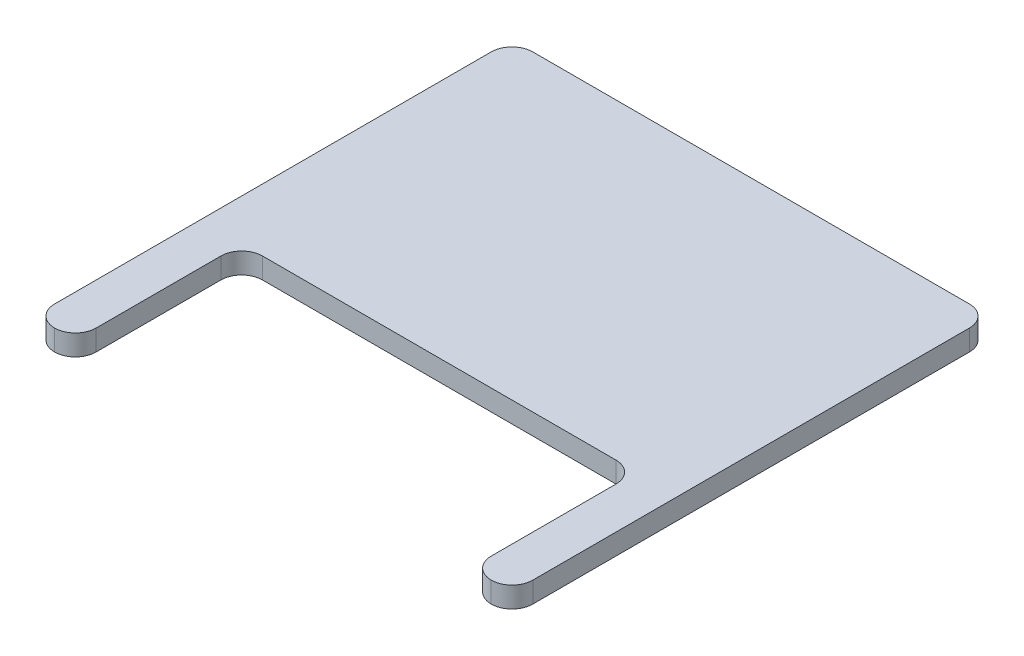
ISO-10303-21;
HEADER;
FILE_DESCRIPTION(('STEP AP214'),'2;1');
FILE_NAME('part.step','',(''),(''),'','','');
FILE_SCHEMA(('AUTOMOTIVE_DESIGN { 1 0 10303 214 1 1 1 1 }'));
ENDSEC;
DATA;
#1=APPLICATION_CONTEXT('core data for automotive mechanical design processes');
#2=APPLICATION_PROTOCOL_DEFINITION('international standard','automotive_design',2000,#1);
#3=PRODUCT_CONTEXT('',#1,'mechanical');
#4=PRODUCT('Part','Part','',(#3));
#5=PRODUCT_RELATED_PRODUCT_CATEGORY('part','',(#4));
#6=PRODUCT_DEFINITION_FORMATION('','',#4);
#7=PRODUCT_DEFINITION_CONTEXT('part definition',#1,'design');
#8=PRODUCT_DEFINITION('design','',#6,#7);
#9=PRODUCT_DEFINITION_SHAPE('','',#8);
#10=(LENGTH_UNIT() NAMED_UNIT(*) SI_UNIT(.MILLI.,.METRE.));
#11=(NAMED_UNIT(*) PLANE_ANGLE_UNIT() SI_UNIT($,.RADIAN.));
#12=(NAMED_UNIT(*) SI_UNIT($,.STERADIAN.) SOLID_ANGLE_UNIT());
#13=UNCERTAINTY_MEASURE_WITH_UNIT(LENGTH_MEASURE(1.E-05),#10,'distance_accuracy_value','');
#14=(GEOMETRIC_REPRESENTATION_CONTEXT(3) GLOBAL_UNCERTAINTY_ASSIGNED_CONTEXT((#13)) GLOBAL_UNIT_ASSIGNED_CONTEXT((#10,
#11,#12)) REPRESENTATION_CONTEXT('',''));
#15=CARTESIAN_POINT('',(0.,0.,0.));
#16=DIRECTION('',(0.,0.,1.));
#17=DIRECTION('',(1.,0.,0.));
#18=AXIS2_PLACEMENT_3D('',#15,#16,#17);
#19=CARTESIAN_POINT('',(-133.35,6.35,0.));
#20=DIRECTION('',(1.,0.,0.));
#21=DIRECTION('',(0.,0.,-1.));
#22=AXIS2_PLACEMENT_3D('',#19,#20,#21);
#23=PLANE('',#22);
#24=DIRECTION('',(0.,0.,1.));
#25=VECTOR('',#24,1.);
#26=CARTESIAN_POINT('',(-133.35,0.,0.));
#27=LINE('',#26,#25);
#28=CARTESIAN_POINT('',(-133.35,0.,101.6));
#29=VERTEX_POINT('',#28);
#30=CARTESIAN_POINT('',(-133.35,0.,139.7));
#31=VERTEX_POINT('',#30);
#32=EDGE_CURVE('E259',#29,#31,#27,.T.);
#33=ORIENTED_EDGE('',*,*,#32,.F.);
#34=DIRECTION('',(0.,-1.,0.));
#35=VECTOR('',#34,1.);
#36=CARTESIAN_POINT('',(-133.35,6.35,101.6));
#37=LINE('',#36,#35);
#38=CARTESIAN_POINT('',(-133.35,6.35,101.6));
#39=VERTEX_POINT('',#38);
#40=EDGE_CURVE('E198',#29,#39,#37,.F.);
#41=ORIENTED_EDGE('',*,*,#40,.T.);
#42=DIRECTION('',(0.,0.,1.));
#43=VECTOR('',#42,1.);
#44=CARTESIAN_POINT('',(-133.35,6.35,0.));
#45=LINE('',#44,#43);
#46=CARTESIAN_POINT('',(-133.35,6.35,139.7));
#47=VERTEX_POINT('',#46);
#48=EDGE_CURVE('E276',#39,#47,#45,.T.);
#49=ORIENTED_EDGE('',*,*,#48,.T.);
#50=DIRECTION('',(0.,-1.,0.));
#51=VECTOR('',#50,1.);
#52=CARTESIAN_POINT('',(-133.35,6.35,139.7));
#53=LINE('',#52,#51);
#54=EDGE_CURVE('E195',#47,#31,#53,.T.);
#55=ORIENTED_EDGE('',*,*,#54,.T.);
#56=EDGE_LOOP('',(#33,#41,#49,#55));
#57=FACE_BOUND('',#56,.T.);
#58=ADVANCED_FACE('F41',(#57),#23,.T.);
#59=CARTESIAN_POINT('',(0.,6.35,95.25));
#60=DIRECTION('',(0.,0.,1.));
#61=DIRECTION('',(1.,0.,0.));
#62=AXIS2_PLACEMENT_3D('',#59,#60,#61);
#63=PLANE('',#62);
#64=DIRECTION('',(-1.,0.,0.));
#65=VECTOR('',#64,1.);
#66=CARTESIAN_POINT('',(0.,0.,95.25));
#67=LINE('',#66,#65);
#68=CARTESIAN_POINT('',(-19.05,0.,95.25));
#69=VERTEX_POINT('',#68);
#70=CARTESIAN_POINT('',(-127.,0.,95.25));
#71=VERTEX_POINT('',#70);
#72=EDGE_CURVE('E171',#69,#71,#67,.T.);
#73=ORIENTED_EDGE('',*,*,#72,.F.);
#74=DIRECTION('',(0.,-1.,0.));
#75=VECTOR('',#74,1.);
#76=CARTESIAN_POINT('',(-19.05,6.35,95.25));
#77=LINE('',#76,#75);
#78=CARTESIAN_POINT('',(-19.05,6.35,95.25));
#79=VERTEX_POINT('',#78);
#80=EDGE_CURVE('E192',#69,#79,#77,.F.);
#81=ORIENTED_EDGE('',*,*,#80,.T.);
#82=DIRECTION('',(-1.,0.,0.));
#83=VECTOR('',#82,1.);
#84=CARTESIAN_POINT('',(0.,6.35,95.25));
#85=LINE('',#84,#83);
#86=CARTESIAN_POINT('',(-127.,6.35,95.25));
#87=VERTEX_POINT('',#86);
#88=EDGE_CURVE('E282',#79,#87,#85,.T.);
#89=ORIENTED_EDGE('',*,*,#88,.T.);
#90=DIRECTION('',(0.,-1.,0.));
#91=VECTOR('',#90,1.);
#92=CARTESIAN_POINT('',(-127.,0.,95.25));
#93=LINE('',#92,#91);
#94=EDGE_CURVE('E181',#87,#71,#93,.T.);
#95=ORIENTED_EDGE('',*,*,#94,.T.);
#96=EDGE_LOOP('',(#73,#81,#89,#95));
#97=FACE_BOUND('',#96,.T.);
#98=ADVANCED_FACE('F324',(#97),#63,.T.);
#99=CARTESIAN_POINT('',(-12.7,6.35,0.));
#100=DIRECTION('',(-1.,0.,0.));
#101=DIRECTION('',(0.,0.,1.));
#102=AXIS2_PLACEMENT_3D('',#99,#100,#101);
#103=PLANE('',#102);
#104=DIRECTION('',(0.,0.,-1.));
#105=VECTOR('',#104,1.);
#106=CARTESIAN_POINT('',(-12.7,6.35,0.));
#107=LINE('',#106,#105);
#108=CARTESIAN_POINT('',(-12.7,6.35,139.7));
#109=VERTEX_POINT('',#108);
#110=CARTESIAN_POINT('',(-12.7,6.35,101.6));
#111=VERTEX_POINT('',#110);
#112=EDGE_CURVE('E287',#109,#111,#107,.T.);
#113=ORIENTED_EDGE('',*,*,#112,.T.);
#114=DIRECTION('',(0.,-1.,0.));
#115=VECTOR('',#114,1.);
#116=CARTESIAN_POINT('',(-12.7,0.,101.6));
#117=LINE('',#116,#115);
#118=CARTESIAN_POINT('',(-12.7,0.,101.6));
#119=VERTEX_POINT('',#118);
#120=EDGE_CURVE('E168',#111,#119,#117,.T.);
#121=ORIENTED_EDGE('',*,*,#120,.T.);
#122=DIRECTION('',(0.,0.,-1.));
#123=VECTOR('',#122,1.);
#124=CARTESIAN_POINT('',(-12.7,0.,0.));
#125=LINE('',#124,#123);
#126=CARTESIAN_POINT('',(-12.7,0.,139.7));
#127=VERTEX_POINT('',#126);
#128=EDGE_CURVE('E151',#127,#119,#125,.T.);
#129=ORIENTED_EDGE('',*,*,#128,.F.);
#130=DIRECTION('',(0.,-1.,0.));
#131=VECTOR('',#130,1.);
#132=CARTESIAN_POINT('',(-12.7,6.35,139.7));
#133=LINE('',#132,#131);
#134=EDGE_CURVE('E165',#127,#109,#133,.F.);
#135=ORIENTED_EDGE('',*,*,#134,.T.);
#136=EDGE_LOOP('',(#113,#121,#129,#135));
#137=FACE_BOUND('',#136,.T.);
#138=ADVANCED_FACE('F164',(#137),#103,.T.);
#139=CARTESIAN_POINT('',(0.,6.35,0.));
#140=DIRECTION('',(1.,0.,0.));
#141=DIRECTION('',(0.,0.,-1.));
#142=AXIS2_PLACEMENT_3D('',#139,#140,#141);
#143=PLANE('',#142);
#144=DIRECTION('',(0.,0.,1.));
#145=VECTOR('',#144,1.);
#146=CARTESIAN_POINT('',(0.,6.35,0.));
#147=LINE('',#146,#145);
#148=CARTESIAN_POINT('',(0.,6.35,6.35));
#149=VERTEX_POINT('',#148);
#150=CARTESIAN_POINT('',(0.,6.35,139.7));
#151=VERTEX_POINT('',#150);
#152=EDGE_CURVE('E294',#149,#151,#147,.T.);
#153=ORIENTED_EDGE('',*,*,#152,.T.);
#154=DIRECTION('',(0.,-1.,0.));
#155=VECTOR('',#154,1.);
#156=CARTESIAN_POINT('',(0.,6.35,139.7));
#157=LINE('',#156,#155);
#158=CARTESIAN_POINT('',(0.,0.,139.7));
#159=VERTEX_POINT('',#158);
#160=EDGE_CURVE('E204',#151,#159,#157,.T.);
#161=ORIENTED_EDGE('',*,*,#160,.T.);
#162=DIRECTION('',(0.,0.,1.));
#163=VECTOR('',#162,1.);
#164=CARTESIAN_POINT('',(0.,0.,0.));
#165=LINE('',#164,#163);
#166=CARTESIAN_POINT('',(0.,0.,6.35));
#167=VERTEX_POINT('',#166);
#168=EDGE_CURVE('E170',#167,#159,#165,.T.);
#169=ORIENTED_EDGE('',*,*,#168,.F.);
#170=DIRECTION('',(0.,-1.,0.));
#171=VECTOR('',#170,1.);
#172=CARTESIAN_POINT('',(0.,6.35,6.35));
#173=LINE('',#172,#171);
#174=EDGE_CURVE('E201',#167,#149,#173,.F.);
#175=ORIENTED_EDGE('',*,*,#174,.T.);
#176=EDGE_LOOP('',(#153,#161,#169,#175));
#177=FACE_BOUND('',#176,.T.);
#178=ADVANCED_FACE('F333',(#177),#143,.T.);
#179=CARTESIAN_POINT('',(0.,6.35,0.));
#180=DIRECTION('',(0.,0.,1.));
#181=DIRECTION('',(1.,0.,0.));
#182=AXIS2_PLACEMENT_3D('',#179,#180,#181);
#183=PLANE('',#182);
#184=DIRECTION('',(-1.,0.,0.));
#185=VECTOR('',#184,1.);
#186=CARTESIAN_POINT('',(0.,0.,0.));
#187=LINE('',#186,#185);
#188=CARTESIAN_POINT('',(-6.35,0.,0.));
#189=VERTEX_POINT('',#188);
#190=CARTESIAN_POINT('',(-139.7,0.,0.));
#191=VERTEX_POINT('',#190);
#192=EDGE_CURVE('E290',#189,#191,#187,.T.);
#193=ORIENTED_EDGE('',*,*,#192,.T.);
#194=DIRECTION('',(0.,-1.,0.));
#195=VECTOR('',#194,1.);
#196=CARTESIAN_POINT('',(-139.7,6.35,0.));
#197=LINE('',#196,#195);
#198=CARTESIAN_POINT('',(-139.7,6.35,0.));
#199=VERTEX_POINT('',#198);
#200=EDGE_CURVE('E247',#191,#199,#197,.F.);
#201=ORIENTED_EDGE('',*,*,#200,.T.);
#202=DIRECTION('',(-1.,0.,0.));
#203=VECTOR('',#202,1.);
#204=CARTESIAN_POINT('',(0.,6.35,0.));
#205=LINE('',#204,#203);
#206=CARTESIAN_POINT('',(-6.35,6.35,0.));
#207=VERTEX_POINT('',#206);
#208=EDGE_CURVE('E183',#207,#199,#205,.T.);
#209=ORIENTED_EDGE('',*,*,#208,.F.);
#210=DIRECTION('',(0.,-1.,0.));
#211=VECTOR('',#210,1.);
#212=CARTESIAN_POINT('',(-6.35,0.,0.));
#213=LINE('',#212,#211);
#214=EDGE_CURVE('E243',#207,#189,#213,.T.);
#215=ORIENTED_EDGE('',*,*,#214,.T.);
#216=EDGE_LOOP('',(#193,#201,#209,#215));
#217=FACE_BOUND('',#216,.T.);
#218=ADVANCED_FACE('F309',(#217),#183,.F.);
#219=CARTESIAN_POINT('',(-146.05,6.35,0.));
#220=DIRECTION('',(1.,0.,0.));
#221=DIRECTION('',(0.,0.,-1.));
#222=AXIS2_PLACEMENT_3D('',#219,#220,#221);
#223=PLANE('',#222);
#224=DIRECTION('',(0.,0.,1.));
#225=VECTOR('',#224,1.);
#226=CARTESIAN_POINT('',(-146.05,6.35,0.));
#227=LINE('',#226,#225);
#228=CARTESIAN_POINT('',(-146.05,6.35,6.35000000000002));
#229=VERTEX_POINT('',#228);
#230=CARTESIAN_POINT('',(-146.05,6.35,139.7));
#231=VERTEX_POINT('',#230);
#232=EDGE_CURVE('E177',#229,#231,#227,.T.);
#233=ORIENTED_EDGE('',*,*,#232,.F.);
#234=DIRECTION('',(0.,-1.,0.));
#235=VECTOR('',#234,1.);
#236=CARTESIAN_POINT('',(-146.05,6.35,6.35000000000002));
#237=LINE('',#236,#235);
#238=CARTESIAN_POINT('',(-146.05,0.,6.35000000000002));
#239=VERTEX_POINT('',#238);
#240=EDGE_CURVE('E239',#229,#239,#237,.T.);
#241=ORIENTED_EDGE('',*,*,#240,.T.);
#242=DIRECTION('',(0.,0.,1.));
#243=VECTOR('',#242,1.);
#244=CARTESIAN_POINT('',(-146.05,0.,0.));
#245=LINE('',#244,#243);
#246=CARTESIAN_POINT('',(-146.05,0.,139.7));
#247=VERTEX_POINT('',#246);
#248=EDGE_CURVE('E186',#239,#247,#245,.T.);
#249=ORIENTED_EDGE('',*,*,#248,.T.);
#250=DIRECTION('',(0.,-1.,0.));
#251=VECTOR('',#250,1.);
#252=CARTESIAN_POINT('',(-146.05,6.35,139.7));
#253=LINE('',#252,#251);
#254=EDGE_CURVE('E236',#247,#231,#253,.F.);
#255=ORIENTED_EDGE('',*,*,#254,.T.);
#256=EDGE_LOOP('',(#233,#241,#249,#255));
#257=FACE_BOUND('',#256,.T.);
#258=ADVANCED_FACE('F316',(#257),#223,.F.);
#259=CARTESIAN_POINT('',(0.,6.35,0.));
#260=DIRECTION('',(0.,1.,0.));
#261=DIRECTION('',(0.,0.,1.));
#262=AXIS2_PLACEMENT_3D('',#259,#260,#261);
#263=PLANE('',#262);
#264=ORIENTED_EDGE('',*,*,#208,.T.);
#265=CARTESIAN_POINT('',(-139.7,6.35,6.35000000000002));
#266=DIRECTION('',(0.,1.,0.));
#267=DIRECTION('',(0.,0.,1.));
#268=AXIS2_PLACEMENT_3D('',#265,#266,#267);
#269=CIRCLE('',#268,6.35);
#270=EDGE_CURVE('E67',#199,#229,#269,.T.);
#271=ORIENTED_EDGE('',*,*,#270,.T.);
#272=ORIENTED_EDGE('',*,*,#232,.T.);
#273=CARTESIAN_POINT('',(-139.7,6.35,139.7));
#274=DIRECTION('',(0.,1.,0.));
#275=DIRECTION('',(0.,0.,1.));
#276=AXIS2_PLACEMENT_3D('',#273,#274,#275);
#277=CIRCLE('',#276,6.35);
#278=CARTESIAN_POINT('',(-139.7,6.35,146.05));
#279=VERTEX_POINT('',#278);
#280=EDGE_CURVE('E59',#231,#279,#277,.T.);
#281=ORIENTED_EDGE('',*,*,#280,.T.);
#282=CARTESIAN_POINT('',(-139.7,6.35,139.7));
#283=DIRECTION('',(0.,1.,0.));
#284=DIRECTION('',(0.,0.,1.));
#285=AXIS2_PLACEMENT_3D('',#282,#283,#284);
#286=CIRCLE('',#285,6.35);
#287=EDGE_CURVE('E221',#279,#47,#286,.T.);
#288=ORIENTED_EDGE('',*,*,#287,.T.);
#289=ORIENTED_EDGE('',*,*,#48,.F.);
#290=CARTESIAN_POINT('',(-127.,6.35,101.6));
#291=DIRECTION('',(0.,1.,0.));
#292=DIRECTION('',(0.,0.,1.));
#293=AXIS2_PLACEMENT_3D('',#290,#291,#292);
#294=CIRCLE('',#293,6.35);
#295=EDGE_CURVE('E11',#39,#87,#294,.F.);
#296=ORIENTED_EDGE('',*,*,#295,.T.);
#297=ORIENTED_EDGE('',*,*,#88,.F.);
#298=CARTESIAN_POINT('',(-19.05,6.35,101.6));
#299=DIRECTION('',(0.,1.,0.));
#300=DIRECTION('',(0.,0.,1.));
#301=AXIS2_PLACEMENT_3D('',#298,#299,#300);
#302=CIRCLE('',#301,6.35);
#303=EDGE_CURVE('E253',#79,#111,#302,.F.);
#304=ORIENTED_EDGE('',*,*,#303,.T.);
#305=ORIENTED_EDGE('',*,*,#112,.F.);
#306=CARTESIAN_POINT('',(-6.34999999999998,6.35,139.7));
#307=DIRECTION('',(0.,1.,0.));
#308=DIRECTION('',(0.,0.,1.));
#309=AXIS2_PLACEMENT_3D('',#306,#307,#308);
#310=CIRCLE('',#309,6.35);
#311=CARTESIAN_POINT('',(-6.34999999999998,6.35,146.05));
#312=VERTEX_POINT('',#311);
#313=EDGE_CURVE('E175',#109,#312,#310,.T.);
#314=ORIENTED_EDGE('',*,*,#313,.T.);
#315=CARTESIAN_POINT('',(-6.34999999999998,6.35,139.7));
#316=DIRECTION('',(0.,1.,0.));
#317=DIRECTION('',(0.,0.,1.));
#318=AXIS2_PLACEMENT_3D('',#315,#316,#317);
#319=CIRCLE('',#318,6.35);
#320=EDGE_CURVE('E228',#312,#151,#319,.T.);
#321=ORIENTED_EDGE('',*,*,#320,.T.);
#322=ORIENTED_EDGE('',*,*,#152,.F.);
#323=CARTESIAN_POINT('',(-6.35,6.35,6.35));
#324=DIRECTION('',(0.,1.,0.));
#325=DIRECTION('',(0.,0.,1.));
#326=AXIS2_PLACEMENT_3D('',#323,#324,#325);
#327=CIRCLE('',#326,6.35);
#328=EDGE_CURVE('E231',#149,#207,#327,.T.);
#329=ORIENTED_EDGE('',*,*,#328,.T.);
#330=EDGE_LOOP('',(#264,#271,#272,#281,#288,#289,#296,#297,#304,#305,#314,#321,#322,#329));
#331=FACE_BOUND('',#330,.T.);
#332=ADVANCED_FACE('F275',(#331),#263,.T.);
#333=CARTESIAN_POINT('',(0.,0.,0.));
#334=DIRECTION('',(0.,1.,0.));
#335=DIRECTION('',(0.,0.,1.));
#336=AXIS2_PLACEMENT_3D('',#333,#334,#335);
#337=PLANE('',#336);
#338=ORIENTED_EDGE('',*,*,#248,.F.);
#339=CARTESIAN_POINT('',(-139.7,0.,6.35000000000002));
#340=DIRECTION('',(0.,1.,0.));
#341=DIRECTION('',(0.,0.,1.));
#342=AXIS2_PLACEMENT_3D('',#339,#340,#341);
#343=CIRCLE('',#342,6.35);
#344=EDGE_CURVE('E218',#239,#191,#343,.F.);
#345=ORIENTED_EDGE('',*,*,#344,.T.);
#346=ORIENTED_EDGE('',*,*,#192,.F.);
#347=CARTESIAN_POINT('',(-6.35,0.,6.35));
#348=DIRECTION('',(0.,1.,0.));
#349=DIRECTION('',(0.,0.,1.));
#350=AXIS2_PLACEMENT_3D('',#347,#348,#349);
#351=CIRCLE('',#350,6.35);
#352=EDGE_CURVE('E215',#189,#167,#351,.F.);
#353=ORIENTED_EDGE('',*,*,#352,.T.);
#354=ORIENTED_EDGE('',*,*,#168,.T.);
#355=CARTESIAN_POINT('',(-6.34999999999998,0.,139.7));
#356=DIRECTION('',(0.,1.,0.));
#357=DIRECTION('',(0.,0.,1.));
#358=AXIS2_PLACEMENT_3D('',#355,#356,#357);
#359=CIRCLE('',#358,6.35);
#360=CARTESIAN_POINT('',(-6.34999999999998,0.,146.05));
#361=VERTEX_POINT('',#360);
#362=EDGE_CURVE('E153',#159,#361,#359,.F.);
#363=ORIENTED_EDGE('',*,*,#362,.T.);
#364=CARTESIAN_POINT('',(-6.34999999999998,0.,139.7));
#365=DIRECTION('',(0.,1.,0.));
#366=DIRECTION('',(0.,0.,1.));
#367=AXIS2_PLACEMENT_3D('',#364,#365,#366);
#368=CIRCLE('',#367,6.35);
#369=EDGE_CURVE('E147',#361,#127,#368,.F.);
#370=ORIENTED_EDGE('',*,*,#369,.T.);
#371=ORIENTED_EDGE('',*,*,#128,.T.);
#372=CARTESIAN_POINT('',(-19.05,0.,101.6));
#373=DIRECTION('',(0.,1.,0.));
#374=DIRECTION('',(0.,0.,1.));
#375=AXIS2_PLACEMENT_3D('',#372,#373,#374);
#376=CIRCLE('',#375,6.35);
#377=EDGE_CURVE('E250',#119,#69,#376,.T.);
#378=ORIENTED_EDGE('',*,*,#377,.T.);
#379=ORIENTED_EDGE('',*,*,#72,.T.);
#380=CARTESIAN_POINT('',(-127.,0.,101.6));
#381=DIRECTION('',(0.,1.,0.));
#382=DIRECTION('',(0.,0.,1.));
#383=AXIS2_PLACEMENT_3D('',#380,#381,#382);
#384=CIRCLE('',#383,6.35);
#385=EDGE_CURVE('E51',#71,#29,#384,.T.);
#386=ORIENTED_EDGE('',*,*,#385,.T.);
#387=ORIENTED_EDGE('',*,*,#32,.T.);
#388=CARTESIAN_POINT('',(-139.7,0.,139.7));
#389=DIRECTION('',(0.,1.,0.));
#390=DIRECTION('',(0.,0.,1.));
#391=AXIS2_PLACEMENT_3D('',#388,#389,#390);
#392=CIRCLE('',#391,6.35);
#393=CARTESIAN_POINT('',(-139.7,0.,146.05));
#394=VERTEX_POINT('',#393);
#395=EDGE_CURVE('E208',#31,#394,#392,.F.);
#396=ORIENTED_EDGE('',*,*,#395,.T.);
#397=CARTESIAN_POINT('',(-139.7,0.,139.7));
#398=DIRECTION('',(0.,1.,0.));
#399=DIRECTION('',(0.,0.,1.));
#400=AXIS2_PLACEMENT_3D('',#397,#398,#399);
#401=CIRCLE('',#400,6.35);
#402=EDGE_CURVE('E159',#394,#247,#401,.F.);
#403=ORIENTED_EDGE('',*,*,#402,.T.);
#404=EDGE_LOOP('',(#338,#345,#346,#353,#354,#363,#370,#371,#378,#379,#386,#387,#396,#403));
#405=FACE_BOUND('',#404,.T.);
#406=ADVANCED_FACE('F150',(#405),#337,.F.);
#407=CARTESIAN_POINT('',(-19.05,6.35,101.6));
#408=DIRECTION('',(0.,1.,0.));
#409=DIRECTION('',(0.,0.,1.));
#410=AXIS2_PLACEMENT_3D('',#407,#408,#409);
#411=CYLINDRICAL_SURFACE('',#410,6.35);
#412=ORIENTED_EDGE('',*,*,#303,.F.);
#413=ORIENTED_EDGE('',*,*,#80,.F.);
#414=ORIENTED_EDGE('',*,*,#377,.F.);
#415=ORIENTED_EDGE('',*,*,#120,.F.);
#416=EDGE_LOOP('',(#412,#413,#414,#415));
#417=FACE_BOUND('',#416,.T.);
#418=ADVANCED_FACE('F327',(#417),#411,.F.);
#419=CARTESIAN_POINT('',(-127.,6.35,101.6));
#420=DIRECTION('',(0.,1.,0.));
#421=DIRECTION('',(0.,0.,1.));
#422=AXIS2_PLACEMENT_3D('',#419,#420,#421);
#423=CYLINDRICAL_SURFACE('',#422,6.35);
#424=ORIENTED_EDGE('',*,*,#295,.F.);
#425=ORIENTED_EDGE('',*,*,#40,.F.);
#426=ORIENTED_EDGE('',*,*,#385,.F.);
#427=ORIENTED_EDGE('',*,*,#94,.F.);
#428=EDGE_LOOP('',(#424,#425,#426,#427));
#429=FACE_BOUND('',#428,.T.);
#430=ADVANCED_FACE('F318',(#429),#423,.F.);
#431=CARTESIAN_POINT('',(-6.34999999999998,6.35,139.7));
#432=DIRECTION('',(0.,-1.,0.));
#433=DIRECTION('',(0.,0.,-1.));
#434=AXIS2_PLACEMENT_3D('',#431,#432,#433);
#435=CYLINDRICAL_SURFACE('',#434,6.35);
#436=DIRECTION('',(0.,-1.,0.));
#437=VECTOR('',#436,1.);
#438=CARTESIAN_POINT('',(-6.34999999999998,6.35,146.05));
#439=LINE('',#438,#437);
#440=EDGE_CURVE('E257',#312,#361,#439,.T.);
#441=ORIENTED_EDGE('',*,*,#440,.F.);
#442=ORIENTED_EDGE('',*,*,#313,.F.);
#443=ORIENTED_EDGE('',*,*,#134,.F.);
#444=ORIENTED_EDGE('',*,*,#369,.F.);
#445=EDGE_LOOP('',(#441,#442,#443,#444));
#446=FACE_BOUND('',#445,.T.);
#447=ADVANCED_FACE('F174',(#446),#435,.T.);
#448=CARTESIAN_POINT('',(-6.34999999999998,6.35,139.7));
#449=DIRECTION('',(0.,-1.,0.));
#450=DIRECTION('',(0.,0.,-1.));
#451=AXIS2_PLACEMENT_3D('',#448,#449,#450);
#452=CYLINDRICAL_SURFACE('',#451,6.35);
#453=ORIENTED_EDGE('',*,*,#320,.F.);
#454=ORIENTED_EDGE('',*,*,#440,.T.);
#455=ORIENTED_EDGE('',*,*,#362,.F.);
#456=ORIENTED_EDGE('',*,*,#160,.F.);
#457=EDGE_LOOP('',(#453,#454,#455,#456));
#458=FACE_BOUND('',#457,.T.);
#459=ADVANCED_FACE('F330',(#458),#452,.T.);
#460=CARTESIAN_POINT('',(-139.7,6.35,6.35000000000002));
#461=DIRECTION('',(0.,-1.,0.));
#462=DIRECTION('',(0.,0.,-1.));
#463=AXIS2_PLACEMENT_3D('',#460,#461,#462);
#464=CYLINDRICAL_SURFACE('',#463,6.35);
#465=ORIENTED_EDGE('',*,*,#270,.F.);
#466=ORIENTED_EDGE('',*,*,#200,.F.);
#467=ORIENTED_EDGE('',*,*,#344,.F.);
#468=ORIENTED_EDGE('',*,*,#240,.F.);
#469=EDGE_LOOP('',(#465,#466,#467,#468));
#470=FACE_BOUND('',#469,.T.);
#471=ADVANCED_FACE('F313',(#470),#464,.T.);
#472=CARTESIAN_POINT('',(-6.35,6.35,6.35));
#473=DIRECTION('',(0.,1.,0.));
#474=DIRECTION('',(0.,0.,1.));
#475=AXIS2_PLACEMENT_3D('',#472,#473,#474);
#476=CYLINDRICAL_SURFACE('',#475,6.35);
#477=ORIENTED_EDGE('',*,*,#328,.F.);
#478=ORIENTED_EDGE('',*,*,#174,.F.);
#479=ORIENTED_EDGE('',*,*,#352,.F.);
#480=ORIENTED_EDGE('',*,*,#214,.F.);
#481=EDGE_LOOP('',(#477,#478,#479,#480));
#482=FACE_BOUND('',#481,.T.);
#483=ADVANCED_FACE('F337',(#482),#476,.T.);
#484=CARTESIAN_POINT('',(-139.7,6.35,139.7));
#485=DIRECTION('',(0.,-1.,0.));
#486=DIRECTION('',(0.,0.,-1.));
#487=AXIS2_PLACEMENT_3D('',#484,#485,#486);
#488=CYLINDRICAL_SURFACE('',#487,6.35);
#489=ORIENTED_EDGE('',*,*,#54,.F.);
#490=ORIENTED_EDGE('',*,*,#287,.F.);
#491=DIRECTION('',(0.,-1.,0.));
#492=VECTOR('',#491,1.);
#493=CARTESIAN_POINT('',(-139.7,6.35,146.05));
#494=LINE('',#493,#492);
#495=EDGE_CURVE('E45',#394,#279,#494,.F.);
#496=ORIENTED_EDGE('',*,*,#495,.F.);
#497=ORIENTED_EDGE('',*,*,#395,.F.);
#498=EDGE_LOOP('',(#489,#490,#496,#497));
#499=FACE_BOUND('',#498,.T.);
#500=ADVANCED_FACE('F43',(#499),#488,.T.);
#501=CARTESIAN_POINT('',(-139.7,6.35,139.7));
#502=DIRECTION('',(0.,1.,0.));
#503=DIRECTION('',(0.,0.,1.));
#504=AXIS2_PLACEMENT_3D('',#501,#502,#503);
#505=CYLINDRICAL_SURFACE('',#504,6.35);
#506=ORIENTED_EDGE('',*,*,#280,.F.);
#507=ORIENTED_EDGE('',*,*,#254,.F.);
#508=ORIENTED_EDGE('',*,*,#402,.F.);
#509=ORIENTED_EDGE('',*,*,#495,.T.);
#510=EDGE_LOOP('',(#506,#507,#508,#509));
#511=FACE_BOUND('',#510,.T.);
#512=ADVANCED_FACE('F268',(#511),#505,.T.);
#513=CLOSED_SHELL('',(#58,#98,#138,#178,#218,#258,#332,#406,#418,#430,#447,#459,#471,#483,#500,#512));
#514=MANIFOLD_SOLID_BREP('B2',#513);
#515=ADVANCED_BREP_SHAPE_REPRESENTATION('',(#18,#514),#14);
#516=SHAPE_DEFINITION_REPRESENTATION(#9,#515);
ENDSEC;
END-ISO-10303-21;
